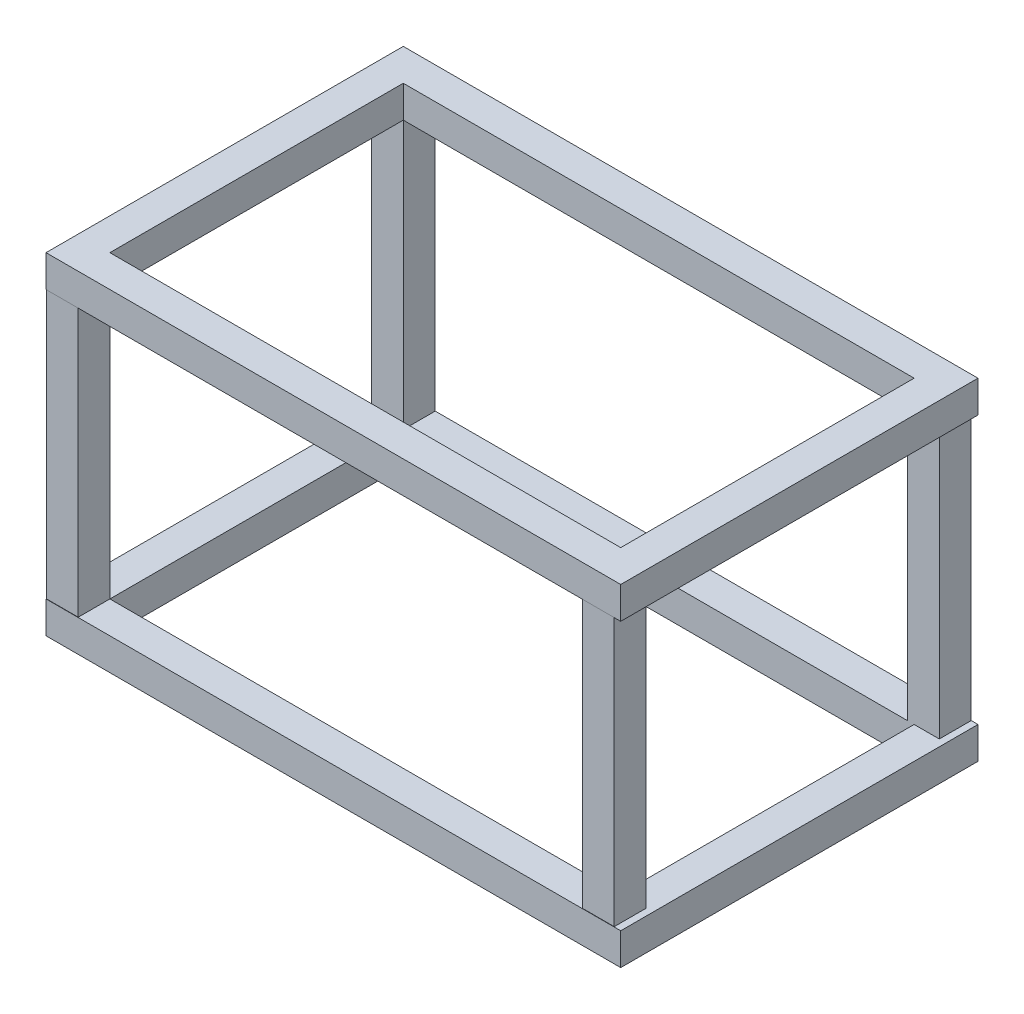
ISO-10303-21;
HEADER;
FILE_DESCRIPTION(('STEP AP214'),'2;1');
FILE_NAME('part.step','',(''),(''),'','','');
FILE_SCHEMA(('AUTOMOTIVE_DESIGN { 1 0 10303 214 1 1 1 1 }'));
ENDSEC;
DATA;
#1=APPLICATION_CONTEXT('core data for automotive mechanical design processes');
#2=APPLICATION_PROTOCOL_DEFINITION('international standard','automotive_design',2000,#1);
#3=PRODUCT_CONTEXT('',#1,'mechanical');
#4=PRODUCT('Part','Part','',(#3));
#5=PRODUCT_RELATED_PRODUCT_CATEGORY('part','',(#4));
#6=PRODUCT_DEFINITION_FORMATION('','',#4);
#7=PRODUCT_DEFINITION_CONTEXT('part definition',#1,'design');
#8=PRODUCT_DEFINITION('design','',#6,#7);
#9=PRODUCT_DEFINITION_SHAPE('','',#8);
#10=(LENGTH_UNIT() NAMED_UNIT(*) SI_UNIT(.MILLI.,.METRE.));
#11=(NAMED_UNIT(*) PLANE_ANGLE_UNIT() SI_UNIT($,.RADIAN.));
#12=(NAMED_UNIT(*) SI_UNIT($,.STERADIAN.) SOLID_ANGLE_UNIT());
#13=UNCERTAINTY_MEASURE_WITH_UNIT(LENGTH_MEASURE(1.E-05),#10,'distance_accuracy_value','');
#14=(GEOMETRIC_REPRESENTATION_CONTEXT(3) GLOBAL_UNCERTAINTY_ASSIGNED_CONTEXT((#13)) GLOBAL_UNIT_ASSIGNED_CONTEXT((#10,
#11,#12)) REPRESENTATION_CONTEXT('',''));
#15=CARTESIAN_POINT('',(0.,0.,0.));
#16=DIRECTION('',(0.,0.,1.));
#17=DIRECTION('',(1.,0.,0.));
#18=AXIS2_PLACEMENT_3D('',#15,#16,#17);
#19=CARTESIAN_POINT('',(0.,25.4,0.));
#20=DIRECTION('',(0.,1.,0.));
#21=DIRECTION('',(0.,0.,1.));
#22=AXIS2_PLACEMENT_3D('',#19,#20,#21);
#23=PLANE('',#22);
#24=DIRECTION('',(1.,0.,0.));
#25=VECTOR('',#24,1.);
#26=CARTESIAN_POINT('',(197.8,25.4,141.859));
#27=LINE('',#26,#25);
#28=CARTESIAN_POINT('',(197.8,25.4,141.859));
#29=VERTEX_POINT('',#28);
#30=CARTESIAN_POINT('',(223.2,25.4,141.859));
#31=VERTEX_POINT('',#30);
#32=EDGE_CURVE('E59',#29,#31,#27,.T.);
#33=ORIENTED_EDGE('',*,*,#32,.F.);
#34=DIRECTION('',(0.,0.,1.));
#35=VECTOR('',#34,1.);
#36=CARTESIAN_POINT('',(197.8,25.4,116.459));
#37=LINE('',#36,#35);
#38=CARTESIAN_POINT('',(197.8,25.4,116.713));
#39=VERTEX_POINT('',#38);
#40=EDGE_CURVE('E298',#39,#29,#37,.T.);
#41=ORIENTED_EDGE('',*,*,#40,.F.);
#42=DIRECTION('',(-1.,0.,0.));
#43=VECTOR('',#42,1.);
#44=CARTESIAN_POINT('',(0.,25.4,116.713));
#45=LINE('',#44,#43);
#46=CARTESIAN_POINT('',(-203.2,25.4,116.713));
#47=VERTEX_POINT('',#46);
#48=EDGE_CURVE('E519',#39,#47,#45,.T.);
#49=ORIENTED_EDGE('',*,*,#48,.T.);
#50=DIRECTION('',(0.,0.,-1.));
#51=VECTOR('',#50,1.);
#52=CARTESIAN_POINT('',(-203.2,25.4,116.459));
#53=LINE('',#52,#51);
#54=CARTESIAN_POINT('',(-203.2,25.4,141.859));
#55=VERTEX_POINT('',#54);
#56=EDGE_CURVE('E348',#55,#47,#53,.T.);
#57=ORIENTED_EDGE('',*,*,#56,.F.);
#58=DIRECTION('',(1.,0.,0.));
#59=VECTOR('',#58,1.);
#60=CARTESIAN_POINT('',(-228.6,25.4,141.859));
#61=LINE('',#60,#59);
#62=CARTESIAN_POINT('',(-228.6,25.4,141.859));
#63=VERTEX_POINT('',#62);
#64=EDGE_CURVE('E353',#63,#55,#61,.T.);
#65=ORIENTED_EDGE('',*,*,#64,.F.);
#66=DIRECTION('',(0.,0.,1.));
#67=VECTOR('',#66,1.);
#68=CARTESIAN_POINT('',(-228.6,25.4,0.));
#69=LINE('',#68,#67);
#70=CARTESIAN_POINT('',(-228.6,25.4,142.113));
#71=VERTEX_POINT('',#70);
#72=EDGE_CURVE('E494',#63,#71,#69,.T.);
#73=ORIENTED_EDGE('',*,*,#72,.T.);
#74=DIRECTION('',(-1.,0.,0.));
#75=VECTOR('',#74,1.);
#76=CARTESIAN_POINT('',(0.,25.4,142.113));
#77=LINE('',#76,#75);
#78=CARTESIAN_POINT('',(228.6,25.4,142.113));
#79=VERTEX_POINT('',#78);
#80=EDGE_CURVE('E500',#79,#71,#77,.T.);
#81=ORIENTED_EDGE('',*,*,#80,.F.);
#82=DIRECTION('',(0.,0.,1.));
#83=VECTOR('',#82,1.);
#84=CARTESIAN_POINT('',(228.6,25.4,0.));
#85=LINE('',#84,#83);
#86=CARTESIAN_POINT('',(228.6,25.4,-142.113));
#87=VERTEX_POINT('',#86);
#88=EDGE_CURVE('E504',#87,#79,#85,.T.);
#89=ORIENTED_EDGE('',*,*,#88,.F.);
#90=DIRECTION('',(-1.,0.,0.));
#91=VECTOR('',#90,1.);
#92=CARTESIAN_POINT('',(0.,25.4,-142.113));
#93=LINE('',#92,#91);
#94=CARTESIAN_POINT('',(223.2,25.4,-142.113));
#95=VERTEX_POINT('',#94);
#96=EDGE_CURVE('E491',#87,#95,#93,.T.);
#97=ORIENTED_EDGE('',*,*,#96,.T.);
#98=DIRECTION('',(0.,0.,-1.));
#99=VECTOR('',#98,1.);
#100=CARTESIAN_POINT('',(223.2,25.4,-142.113));
#101=LINE('',#100,#99);
#102=CARTESIAN_POINT('',(223.2,25.4,-116.713));
#103=VERTEX_POINT('',#102);
#104=EDGE_CURVE('E304',#103,#95,#101,.T.);
#105=ORIENTED_EDGE('',*,*,#104,.F.);
#106=DIRECTION('',(1.,0.,0.));
#107=VECTOR('',#106,1.);
#108=CARTESIAN_POINT('',(197.8,25.4,-116.713));
#109=LINE('',#108,#107);
#110=CARTESIAN_POINT('',(203.2,25.4,-116.713));
#111=VERTEX_POINT('',#110);
#112=EDGE_CURVE('E310',#111,#103,#109,.T.);
#113=ORIENTED_EDGE('',*,*,#112,.F.);
#114=DIRECTION('',(0.,0.,1.));
#115=VECTOR('',#114,1.);
#116=CARTESIAN_POINT('',(203.2,25.4,0.));
#117=LINE('',#116,#115);
#118=CARTESIAN_POINT('',(203.2,25.4,116.459));
#119=VERTEX_POINT('',#118);
#120=EDGE_CURVE('E515',#111,#119,#117,.T.);
#121=ORIENTED_EDGE('',*,*,#120,.T.);
#122=DIRECTION('',(-1.,0.,0.));
#123=VECTOR('',#122,1.);
#124=CARTESIAN_POINT('',(197.8,25.4,116.459));
#125=LINE('',#124,#123);
#126=CARTESIAN_POINT('',(223.2,25.4,116.459));
#127=VERTEX_POINT('',#126);
#128=EDGE_CURVE('E668',#127,#119,#125,.T.);
#129=ORIENTED_EDGE('',*,*,#128,.F.);
#130=DIRECTION('',(0.,0.,-1.));
#131=VECTOR('',#130,1.);
#132=CARTESIAN_POINT('',(223.2,25.4,116.459));
#133=LINE('',#132,#131);
#134=EDGE_CURVE('E64',#31,#127,#133,.T.);
#135=ORIENTED_EDGE('',*,*,#134,.F.);
#136=EDGE_LOOP('',(#33,#41,#49,#57,#65,#73,#81,#89,#97,#105,#113,#121,#129,#135));
#137=FACE_BOUND('',#136,.T.);
#138=ADVANCED_FACE('F41',(#137),#23,.T.);
#139=CARTESIAN_POINT('',(0.,238.572,0.));
#140=DIRECTION('',(0.,1.,0.));
#141=DIRECTION('',(0.,0.,1.));
#142=AXIS2_PLACEMENT_3D('',#139,#140,#141);
#143=PLANE('',#142);
#144=DIRECTION('',(0.,0.,1.));
#145=VECTOR('',#144,1.);
#146=CARTESIAN_POINT('',(197.8,238.572,116.459));
#147=LINE('',#146,#145);
#148=CARTESIAN_POINT('',(197.8,238.572,116.713));
#149=VERTEX_POINT('',#148);
#150=CARTESIAN_POINT('',(197.8,238.572,141.859));
#151=VERTEX_POINT('',#150);
#152=EDGE_CURVE('E266',#149,#151,#147,.T.);
#153=ORIENTED_EDGE('',*,*,#152,.T.);
#154=DIRECTION('',(1.,0.,0.));
#155=VECTOR('',#154,1.);
#156=CARTESIAN_POINT('',(197.8,238.572,141.859));
#157=LINE('',#156,#155);
#158=CARTESIAN_POINT('',(223.2,238.572,141.859));
#159=VERTEX_POINT('',#158);
#160=EDGE_CURVE('E271',#151,#159,#157,.T.);
#161=ORIENTED_EDGE('',*,*,#160,.T.);
#162=DIRECTION('',(0.,0.,-1.));
#163=VECTOR('',#162,1.);
#164=CARTESIAN_POINT('',(223.2,238.572,116.459));
#165=LINE('',#164,#163);
#166=CARTESIAN_POINT('',(223.2,238.572,116.459));
#167=VERTEX_POINT('',#166);
#168=EDGE_CURVE('E249',#159,#167,#165,.T.);
#169=ORIENTED_EDGE('',*,*,#168,.T.);
#170=DIRECTION('',(-1.,0.,0.));
#171=VECTOR('',#170,1.);
#172=CARTESIAN_POINT('',(197.8,238.572,116.459));
#173=LINE('',#172,#171);
#174=CARTESIAN_POINT('',(203.2,238.572,116.459));
#175=VERTEX_POINT('',#174);
#176=EDGE_CURVE('E258',#167,#175,#173,.T.);
#177=ORIENTED_EDGE('',*,*,#176,.T.);
#178=DIRECTION('',(0.,0.,1.));
#179=VECTOR('',#178,1.);
#180=CARTESIAN_POINT('',(203.2,238.572,0.));
#181=LINE('',#180,#179);
#182=CARTESIAN_POINT('',(203.2,238.572,-116.713));
#183=VERTEX_POINT('',#182);
#184=EDGE_CURVE('E431',#183,#175,#181,.T.);
#185=ORIENTED_EDGE('',*,*,#184,.F.);
#186=DIRECTION('',(1.,0.,0.));
#187=VECTOR('',#186,1.);
#188=CARTESIAN_POINT('',(197.8,238.572,-116.713));
#189=LINE('',#188,#187);
#190=CARTESIAN_POINT('',(223.2,238.572,-116.713));
#191=VERTEX_POINT('',#190);
#192=EDGE_CURVE('E323',#183,#191,#189,.T.);
#193=ORIENTED_EDGE('',*,*,#192,.T.);
#194=DIRECTION('',(0.,0.,-1.));
#195=VECTOR('',#194,1.);
#196=CARTESIAN_POINT('',(223.2,238.572,-142.113));
#197=LINE('',#196,#195);
#198=CARTESIAN_POINT('',(223.2,238.572,-142.113));
#199=VERTEX_POINT('',#198);
#200=EDGE_CURVE('E319',#191,#199,#197,.T.);
#201=ORIENTED_EDGE('',*,*,#200,.T.);
#202=DIRECTION('',(-1.,0.,0.));
#203=VECTOR('',#202,1.);
#204=CARTESIAN_POINT('',(0.,238.572,-142.113));
#205=LINE('',#204,#203);
#206=CARTESIAN_POINT('',(228.6,238.572,-142.113));
#207=VERTEX_POINT('',#206);
#208=EDGE_CURVE('E408',#207,#199,#205,.T.);
#209=ORIENTED_EDGE('',*,*,#208,.F.);
#210=DIRECTION('',(0.,0.,1.));
#211=VECTOR('',#210,1.);
#212=CARTESIAN_POINT('',(228.6,238.572,0.));
#213=LINE('',#212,#211);
#214=CARTESIAN_POINT('',(228.6,238.572,142.113));
#215=VERTEX_POINT('',#214);
#216=EDGE_CURVE('E421',#207,#215,#213,.T.);
#217=ORIENTED_EDGE('',*,*,#216,.T.);
#218=DIRECTION('',(-1.,0.,0.));
#219=VECTOR('',#218,1.);
#220=CARTESIAN_POINT('',(0.,238.572,142.113));
#221=LINE('',#220,#219);
#222=CARTESIAN_POINT('',(-228.6,238.572,142.113));
#223=VERTEX_POINT('',#222);
#224=EDGE_CURVE('E417',#215,#223,#221,.T.);
#225=ORIENTED_EDGE('',*,*,#224,.T.);
#226=DIRECTION('',(0.,0.,1.));
#227=VECTOR('',#226,1.);
#228=CARTESIAN_POINT('',(-228.6,238.572,0.));
#229=LINE('',#228,#227);
#230=CARTESIAN_POINT('',(-228.6,238.572,141.859));
#231=VERTEX_POINT('',#230);
#232=EDGE_CURVE('E412',#231,#223,#229,.T.);
#233=ORIENTED_EDGE('',*,*,#232,.F.);
#234=DIRECTION('',(1.,0.,0.));
#235=VECTOR('',#234,1.);
#236=CARTESIAN_POINT('',(-228.6,238.572,141.859));
#237=LINE('',#236,#235);
#238=CARTESIAN_POINT('',(-203.2,238.572,141.859));
#239=VERTEX_POINT('',#238);
#240=EDGE_CURVE('E363',#231,#239,#237,.T.);
#241=ORIENTED_EDGE('',*,*,#240,.T.);
#242=DIRECTION('',(0.,0.,-1.));
#243=VECTOR('',#242,1.);
#244=CARTESIAN_POINT('',(-203.2,238.572,116.459));
#245=LINE('',#244,#243);
#246=CARTESIAN_POINT('',(-203.2,238.572,116.713));
#247=VERTEX_POINT('',#246);
#248=EDGE_CURVE('E358',#239,#247,#245,.T.);
#249=ORIENTED_EDGE('',*,*,#248,.T.);
#250=DIRECTION('',(-1.,0.,0.));
#251=VECTOR('',#250,1.);
#252=CARTESIAN_POINT('',(0.,238.572,116.713));
#253=LINE('',#252,#251);
#254=EDGE_CURVE('E434',#149,#247,#253,.T.);
#255=ORIENTED_EDGE('',*,*,#254,.F.);
#256=EDGE_LOOP('',(#153,#161,#169,#177,#185,#193,#201,#209,#217,#225,#233,#241,#249,#255));
#257=FACE_BOUND('',#256,.T.);
#258=ADVANCED_FACE('F270',(#257),#143,.F.);
#259=DIRECTION('',(-1.,0.,0.));
#260=VECTOR('',#259,1.);
#261=CARTESIAN_POINT('',(0.,25.4,-116.713));
#262=LINE('',#261,#260);
#263=CARTESIAN_POINT('',(197.8,25.4,-116.713));
#264=VERTEX_POINT('',#263);
#265=CARTESIAN_POINT('',(-203.2,25.4,-116.713));
#266=VERTEX_POINT('',#265);
#267=EDGE_CURVE('E512',#264,#266,#262,.T.);
#268=ORIENTED_EDGE('',*,*,#267,.F.);
#269=DIRECTION('',(0.,0.,1.));
#270=VECTOR('',#269,1.);
#271=CARTESIAN_POINT('',(197.8,25.4,-142.113));
#272=LINE('',#271,#270);
#273=CARTESIAN_POINT('',(197.8,25.4,-142.113));
#274=VERTEX_POINT('',#273);
#275=EDGE_CURVE('E315',#274,#264,#272,.T.);
#276=ORIENTED_EDGE('',*,*,#275,.F.);
#277=CARTESIAN_POINT('',(-203.2,25.4,-142.113));
#278=VERTEX_POINT('',#277);
#279=EDGE_CURVE('E495',#274,#278,#93,.T.);
#280=ORIENTED_EDGE('',*,*,#279,.T.);
#281=DIRECTION('',(0.,0.,-1.));
#282=VECTOR('',#281,1.);
#283=CARTESIAN_POINT('',(-203.2,25.4,-142.113));
#284=LINE('',#283,#282);
#285=EDGE_CURVE('E463',#266,#278,#284,.T.);
#286=ORIENTED_EDGE('',*,*,#285,.F.);
#287=EDGE_LOOP('',(#268,#276,#280,#286));
#288=FACE_BOUND('',#287,.T.);
#289=ADVANCED_FACE('F606',(#288),#23,.T.);
#290=DIRECTION('',(0.,0.,1.));
#291=VECTOR('',#290,1.);
#292=CARTESIAN_POINT('',(197.8,238.572,-142.113));
#293=LINE('',#292,#291);
#294=CARTESIAN_POINT('',(197.8,238.572,-142.113));
#295=VERTEX_POINT('',#294);
#296=CARTESIAN_POINT('',(197.8,238.572,-116.713));
#297=VERTEX_POINT('',#296);
#298=EDGE_CURVE('E326',#295,#297,#293,.T.);
#299=ORIENTED_EDGE('',*,*,#298,.T.);
#300=DIRECTION('',(-1.,0.,0.));
#301=VECTOR('',#300,1.);
#302=CARTESIAN_POINT('',(0.,238.572,-116.713));
#303=LINE('',#302,#301);
#304=CARTESIAN_POINT('',(-203.2,238.572,-116.713));
#305=VERTEX_POINT('',#304);
#306=EDGE_CURVE('E428',#297,#305,#303,.T.);
#307=ORIENTED_EDGE('',*,*,#306,.T.);
#308=DIRECTION('',(0.,0.,-1.));
#309=VECTOR('',#308,1.);
#310=CARTESIAN_POINT('',(-203.2,238.572,-142.113));
#311=LINE('',#310,#309);
#312=CARTESIAN_POINT('',(-203.2,238.572,-142.113));
#313=VERTEX_POINT('',#312);
#314=EDGE_CURVE('E473',#305,#313,#311,.T.);
#315=ORIENTED_EDGE('',*,*,#314,.T.);
#316=EDGE_CURVE('E362',#295,#313,#205,.T.);
#317=ORIENTED_EDGE('',*,*,#316,.F.);
#318=EDGE_LOOP('',(#299,#307,#315,#317));
#319=FACE_BOUND('',#318,.T.);
#320=ADVANCED_FACE('F612',(#319),#143,.F.);
#321=CARTESIAN_POINT('',(-228.6,25.4,-116.713));
#322=VERTEX_POINT('',#321);
#323=CARTESIAN_POINT('',(-228.6,25.4,116.459));
#324=VERTEX_POINT('',#323);
#325=EDGE_CURVE('E496',#322,#324,#69,.T.);
#326=ORIENTED_EDGE('',*,*,#325,.T.);
#327=DIRECTION('',(-1.,0.,0.));
#328=VECTOR('',#327,1.);
#329=CARTESIAN_POINT('',(-228.6,25.4,116.459));
#330=LINE('',#329,#328);
#331=CARTESIAN_POINT('',(-203.2,25.4,116.459));
#332=VERTEX_POINT('',#331);
#333=EDGE_CURVE('E342',#332,#324,#330,.T.);
#334=ORIENTED_EDGE('',*,*,#333,.F.);
#335=DIRECTION('',(0.,0.,1.));
#336=VECTOR('',#335,1.);
#337=CARTESIAN_POINT('',(-203.2,25.4,0.));
#338=LINE('',#337,#336);
#339=EDGE_CURVE('E508',#266,#332,#338,.T.);
#340=ORIENTED_EDGE('',*,*,#339,.F.);
#341=DIRECTION('',(1.,0.,0.));
#342=VECTOR('',#341,1.);
#343=CARTESIAN_POINT('',(-228.6,25.4,-116.713));
#344=LINE('',#343,#342);
#345=EDGE_CURVE('E469',#322,#266,#344,.T.);
#346=ORIENTED_EDGE('',*,*,#345,.F.);
#347=EDGE_LOOP('',(#326,#334,#340,#346));
#348=FACE_BOUND('',#347,.T.);
#349=ADVANCED_FACE('F605',(#348),#23,.T.);
#350=DIRECTION('',(-1.,0.,0.));
#351=VECTOR('',#350,1.);
#352=CARTESIAN_POINT('',(-228.6,238.572,116.459));
#353=LINE('',#352,#351);
#354=CARTESIAN_POINT('',(-203.2,238.572,116.459));
#355=VERTEX_POINT('',#354);
#356=CARTESIAN_POINT('',(-228.6,238.572,116.459));
#357=VERTEX_POINT('',#356);
#358=EDGE_CURVE('E346',#355,#357,#353,.T.);
#359=ORIENTED_EDGE('',*,*,#358,.T.);
#360=CARTESIAN_POINT('',(-228.6,238.572,-116.713));
#361=VERTEX_POINT('',#360);
#362=EDGE_CURVE('E413',#361,#357,#229,.T.);
#363=ORIENTED_EDGE('',*,*,#362,.F.);
#364=DIRECTION('',(1.,0.,0.));
#365=VECTOR('',#364,1.);
#366=CARTESIAN_POINT('',(-228.6,238.572,-116.713));
#367=LINE('',#366,#365);
#368=EDGE_CURVE('E478',#361,#305,#367,.T.);
#369=ORIENTED_EDGE('',*,*,#368,.T.);
#370=DIRECTION('',(0.,0.,1.));
#371=VECTOR('',#370,1.);
#372=CARTESIAN_POINT('',(-203.2,238.572,0.));
#373=LINE('',#372,#371);
#374=EDGE_CURVE('E425',#305,#355,#373,.T.);
#375=ORIENTED_EDGE('',*,*,#374,.T.);
#376=EDGE_LOOP('',(#359,#363,#369,#375));
#377=FACE_BOUND('',#376,.T.);
#378=ADVANCED_FACE('F611',(#377),#143,.F.);
#379=CARTESIAN_POINT('',(-203.2,25.4,0.));
#380=DIRECTION('',(1.,0.,0.));
#381=DIRECTION('',(0.,0.,-1.));
#382=AXIS2_PLACEMENT_3D('',#379,#380,#381);
#383=PLANE('',#382);
#384=DIRECTION('',(0.,0.,1.));
#385=VECTOR('',#384,1.);
#386=CARTESIAN_POINT('',(-203.2,0.,0.));
#387=LINE('',#386,#385);
#388=CARTESIAN_POINT('',(-203.2,0.,-116.713));
#389=VERTEX_POINT('',#388);
#390=CARTESIAN_POINT('',(-203.2,0.,116.713));
#391=VERTEX_POINT('',#390);
#392=EDGE_CURVE('E540',#389,#391,#387,.T.);
#393=ORIENTED_EDGE('',*,*,#392,.F.);
#394=DIRECTION('',(0.,-1.,0.));
#395=VECTOR('',#394,1.);
#396=CARTESIAN_POINT('',(-203.2,25.4,-116.713));
#397=LINE('',#396,#395);
#398=EDGE_CURVE('E11',#266,#389,#397,.T.);
#399=ORIENTED_EDGE('',*,*,#398,.F.);
#400=ORIENTED_EDGE('',*,*,#339,.T.);
#401=DIRECTION('',(0.,-1.,0.));
#402=VECTOR('',#401,1.);
#403=CARTESIAN_POINT('',(-203.2,274.493024484277,116.459));
#404=LINE('',#403,#402);
#405=EDGE_CURVE('E347',#355,#332,#404,.T.);
#406=ORIENTED_EDGE('',*,*,#405,.F.);
#407=ORIENTED_EDGE('',*,*,#374,.F.);
#408=DIRECTION('',(0.,-1.,0.));
#409=VECTOR('',#408,1.);
#410=CARTESIAN_POINT('',(-203.2,263.972,-116.713));
#411=LINE('',#410,#409);
#412=CARTESIAN_POINT('',(-203.2,263.972,-116.713));
#413=VERTEX_POINT('',#412);
#414=EDGE_CURVE('E450',#413,#305,#411,.T.);
#415=ORIENTED_EDGE('',*,*,#414,.F.);
#416=DIRECTION('',(0.,0.,1.));
#417=VECTOR('',#416,1.);
#418=CARTESIAN_POINT('',(-203.2,263.972,0.));
#419=LINE('',#418,#417);
#420=CARTESIAN_POINT('',(-203.2,263.972,116.713));
#421=VERTEX_POINT('',#420);
#422=EDGE_CURVE('E392',#413,#421,#419,.T.);
#423=ORIENTED_EDGE('',*,*,#422,.T.);
#424=DIRECTION('',(0.,-1.,0.));
#425=VECTOR('',#424,1.);
#426=CARTESIAN_POINT('',(-203.2,263.972,116.713));
#427=LINE('',#426,#425);
#428=EDGE_CURVE('E438',#421,#247,#427,.T.);
#429=ORIENTED_EDGE('',*,*,#428,.T.);
#430=ORIENTED_EDGE('',*,*,#248,.F.);
#431=DIRECTION('',(0.,-1.,0.));
#432=VECTOR('',#431,1.);
#433=CARTESIAN_POINT('',(-203.2,274.493024484277,141.859));
#434=LINE('',#433,#432);
#435=EDGE_CURVE('E352',#239,#55,#434,.T.);
#436=ORIENTED_EDGE('',*,*,#435,.T.);
#437=ORIENTED_EDGE('',*,*,#56,.T.);
#438=DIRECTION('',(0.,-1.,0.));
#439=VECTOR('',#438,1.);
#440=CARTESIAN_POINT('',(-203.2,25.4,116.713));
#441=LINE('',#440,#439);
#442=EDGE_CURVE('E556',#47,#391,#441,.T.);
#443=ORIENTED_EDGE('',*,*,#442,.T.);
#444=EDGE_LOOP('',(#393,#399,#400,#406,#407,#415,#423,#429,#430,#436,#437,#443));
#445=FACE_BOUND('',#444,.T.);
#446=ADVANCED_FACE('F703',(#445),#383,.T.);
#447=CARTESIAN_POINT('',(0.,25.4,-116.713));
#448=DIRECTION('',(0.,0.,1.));
#449=DIRECTION('',(1.,0.,0.));
#450=AXIS2_PLACEMENT_3D('',#447,#448,#449);
#451=PLANE('',#450);
#452=DIRECTION('',(-1.,0.,0.));
#453=VECTOR('',#452,1.);
#454=CARTESIAN_POINT('',(0.,0.,-116.713));
#455=LINE('',#454,#453);
#456=CARTESIAN_POINT('',(203.2,0.,-116.713));
#457=VERTEX_POINT('',#456);
#458=EDGE_CURVE('E544',#457,#389,#455,.T.);
#459=ORIENTED_EDGE('',*,*,#458,.F.);
#460=DIRECTION('',(0.,-1.,0.));
#461=VECTOR('',#460,1.);
#462=CARTESIAN_POINT('',(203.2,25.4,-116.713));
#463=LINE('',#462,#461);
#464=EDGE_CURVE('E51',#111,#457,#463,.T.);
#465=ORIENTED_EDGE('',*,*,#464,.F.);
#466=ORIENTED_EDGE('',*,*,#112,.T.);
#467=DIRECTION('',(0.,-1.,0.));
#468=VECTOR('',#467,1.);
#469=CARTESIAN_POINT('',(223.2,274.493024484277,-116.713));
#470=LINE('',#469,#468);
#471=EDGE_CURVE('E309',#191,#103,#470,.T.);
#472=ORIENTED_EDGE('',*,*,#471,.F.);
#473=ORIENTED_EDGE('',*,*,#192,.F.);
#474=DIRECTION('',(0.,-1.,0.));
#475=VECTOR('',#474,1.);
#476=CARTESIAN_POINT('',(203.2,263.972,-116.713));
#477=LINE('',#476,#475);
#478=CARTESIAN_POINT('',(203.2,263.972,-116.713));
#479=VERTEX_POINT('',#478);
#480=EDGE_CURVE('E447',#479,#183,#477,.T.);
#481=ORIENTED_EDGE('',*,*,#480,.F.);
#482=DIRECTION('',(-1.,0.,0.));
#483=VECTOR('',#482,1.);
#484=CARTESIAN_POINT('',(0.,263.972,-116.713));
#485=LINE('',#484,#483);
#486=EDGE_CURVE('E396',#479,#413,#485,.T.);
#487=ORIENTED_EDGE('',*,*,#486,.T.);
#488=ORIENTED_EDGE('',*,*,#414,.T.);
#489=ORIENTED_EDGE('',*,*,#306,.F.);
#490=DIRECTION('',(0.,-1.,0.));
#491=VECTOR('',#490,1.);
#492=CARTESIAN_POINT('',(197.8,274.493024484277,-116.713));
#493=LINE('',#492,#491);
#494=EDGE_CURVE('E314',#297,#264,#493,.T.);
#495=ORIENTED_EDGE('',*,*,#494,.T.);
#496=ORIENTED_EDGE('',*,*,#267,.T.);
#497=ORIENTED_EDGE('',*,*,#398,.T.);
#498=EDGE_LOOP('',(#459,#465,#466,#472,#473,#481,#487,#488,#489,#495,#496,#497));
#499=FACE_BOUND('',#498,.T.);
#500=ADVANCED_FACE('F629',(#499),#451,.T.);
#501=CARTESIAN_POINT('',(203.2,25.4,0.));
#502=DIRECTION('',(1.,0.,0.));
#503=DIRECTION('',(0.,0.,-1.));
#504=AXIS2_PLACEMENT_3D('',#501,#502,#503);
#505=PLANE('',#504);
#506=DIRECTION('',(0.,0.,1.));
#507=VECTOR('',#506,1.);
#508=CARTESIAN_POINT('',(203.2,0.,0.));
#509=LINE('',#508,#507);
#510=CARTESIAN_POINT('',(203.2,0.,116.713));
#511=VERTEX_POINT('',#510);
#512=EDGE_CURVE('E548',#457,#511,#509,.T.);
#513=ORIENTED_EDGE('',*,*,#512,.T.);
#514=DIRECTION('',(0.,-1.,0.));
#515=VECTOR('',#514,1.);
#516=CARTESIAN_POINT('',(203.2,25.4,116.713));
#517=LINE('',#516,#515);
#518=CARTESIAN_POINT('',(203.2,25.4,116.713));
#519=VERTEX_POINT('',#518);
#520=EDGE_CURVE('E559',#519,#511,#517,.T.);
#521=ORIENTED_EDGE('',*,*,#520,.F.);
#522=DIRECTION('',(0.,0.,1.));
#523=VECTOR('',#522,1.);
#524=CARTESIAN_POINT('',(203.2,25.4,0.));
#525=LINE('',#524,#523);
#526=EDGE_CURVE('E278',#119,#519,#525,.T.);
#527=ORIENTED_EDGE('',*,*,#526,.F.);
#528=ORIENTED_EDGE('',*,*,#120,.F.);
#529=ORIENTED_EDGE('',*,*,#464,.T.);
#530=EDGE_LOOP('',(#513,#521,#527,#528,#529));
#531=FACE_BOUND('',#530,.T.);
#532=ADVANCED_FACE('F665',(#531),#505,.F.);
#533=CARTESIAN_POINT('',(0.,25.4,-142.113));
#534=DIRECTION('',(0.,0.,1.));
#535=DIRECTION('',(1.,0.,0.));
#536=AXIS2_PLACEMENT_3D('',#533,#534,#535);
#537=PLANE('',#536);
#538=ORIENTED_EDGE('',*,*,#279,.F.);
#539=DIRECTION('',(0.,-1.,0.));
#540=VECTOR('',#539,1.);
#541=CARTESIAN_POINT('',(197.8,274.493024484277,-142.113));
#542=LINE('',#541,#540);
#543=EDGE_CURVE('E303',#295,#274,#542,.T.);
#544=ORIENTED_EDGE('',*,*,#543,.F.);
#545=ORIENTED_EDGE('',*,*,#316,.T.);
#546=DIRECTION('',(0.,-1.,0.));
#547=VECTOR('',#546,1.);
#548=CARTESIAN_POINT('',(-203.2,274.493024484277,-142.113));
#549=LINE('',#548,#547);
#550=EDGE_CURVE('E467',#313,#278,#549,.T.);
#551=ORIENTED_EDGE('',*,*,#550,.T.);
#552=EDGE_LOOP('',(#538,#544,#545,#551));
#553=FACE_BOUND('',#552,.T.);
#554=DIRECTION('',(-1.,0.,0.));
#555=VECTOR('',#554,1.);
#556=CARTESIAN_POINT('',(0.,0.,-142.113));
#557=LINE('',#556,#555);
#558=CARTESIAN_POINT('',(228.6,0.,-142.113));
#559=VERTEX_POINT('',#558);
#560=CARTESIAN_POINT('',(-228.6,0.,-142.113));
#561=VERTEX_POINT('',#560);
#562=EDGE_CURVE('E477',#559,#561,#557,.T.);
#563=ORIENTED_EDGE('',*,*,#562,.T.);
#564=DIRECTION('',(0.,-1.,0.));
#565=VECTOR('',#564,1.);
#566=CARTESIAN_POINT('',(-228.6,25.4,-142.113));
#567=LINE('',#566,#565);
#568=CARTESIAN_POINT('',(-228.6,263.972,-142.113));
#569=VERTEX_POINT('',#568);
#570=EDGE_CURVE('E45',#569,#561,#567,.T.);
#571=ORIENTED_EDGE('',*,*,#570,.F.);
#572=DIRECTION('',(-1.,0.,0.));
#573=VECTOR('',#572,1.);
#574=CARTESIAN_POINT('',(0.,263.972,-142.113));
#575=LINE('',#574,#573);
#576=CARTESIAN_POINT('',(228.6,263.972,-142.113));
#577=VERTEX_POINT('',#576);
#578=EDGE_CURVE('E376',#577,#569,#575,.T.);
#579=ORIENTED_EDGE('',*,*,#578,.F.);
#580=DIRECTION('',(0.,-1.,0.));
#581=VECTOR('',#580,1.);
#582=CARTESIAN_POINT('',(228.6,263.972,-142.113));
#583=LINE('',#582,#581);
#584=EDGE_CURVE('E407',#577,#207,#583,.T.);
#585=ORIENTED_EDGE('',*,*,#584,.T.);
#586=ORIENTED_EDGE('',*,*,#208,.T.);
#587=DIRECTION('',(0.,-1.,0.));
#588=VECTOR('',#587,1.);
#589=CARTESIAN_POINT('',(223.2,274.493024484277,-142.113));
#590=LINE('',#589,#588);
#591=EDGE_CURVE('E308',#199,#95,#590,.T.);
#592=ORIENTED_EDGE('',*,*,#591,.T.);
#593=ORIENTED_EDGE('',*,*,#96,.F.);
#594=DIRECTION('',(0.,-1.,0.));
#595=VECTOR('',#594,1.);
#596=CARTESIAN_POINT('',(228.6,25.4,-142.113));
#597=LINE('',#596,#595);
#598=EDGE_CURVE('E524',#87,#559,#597,.T.);
#599=ORIENTED_EDGE('',*,*,#598,.T.);
#600=EDGE_LOOP('',(#563,#571,#579,#585,#586,#592,#593,#599));
#601=FACE_BOUND('',#600,.T.);
#602=ADVANCED_FACE('F43',(#553,#601),#537,.F.);
#603=CARTESIAN_POINT('',(-228.6,25.4,0.));
#604=DIRECTION('',(1.,0.,0.));
#605=DIRECTION('',(0.,0.,-1.));
#606=AXIS2_PLACEMENT_3D('',#603,#604,#605);
#607=PLANE('',#606);
#608=ORIENTED_EDGE('',*,*,#72,.F.);
#609=DIRECTION('',(0.,-1.,0.));
#610=VECTOR('',#609,1.);
#611=CARTESIAN_POINT('',(-228.6,274.493024484277,141.859));
#612=LINE('',#611,#610);
#613=EDGE_CURVE('E357',#231,#63,#612,.T.);
#614=ORIENTED_EDGE('',*,*,#613,.F.);
#615=ORIENTED_EDGE('',*,*,#232,.T.);
#616=DIRECTION('',(0.,-1.,0.));
#617=VECTOR('',#616,1.);
#618=CARTESIAN_POINT('',(-228.6,263.972,142.113));
#619=LINE('',#618,#617);
#620=CARTESIAN_POINT('',(-228.6,263.972,142.113));
#621=VERTEX_POINT('',#620);
#622=EDGE_CURVE('E443',#621,#223,#619,.T.);
#623=ORIENTED_EDGE('',*,*,#622,.F.);
#624=DIRECTION('',(0.,0.,1.));
#625=VECTOR('',#624,1.);
#626=CARTESIAN_POINT('',(-228.6,263.972,0.));
#627=LINE('',#626,#625);
#628=EDGE_CURVE('E380',#569,#621,#627,.T.);
#629=ORIENTED_EDGE('',*,*,#628,.F.);
#630=ORIENTED_EDGE('',*,*,#570,.T.);
#631=DIRECTION('',(0.,0.,1.));
#632=VECTOR('',#631,1.);
#633=CARTESIAN_POINT('',(-228.6,0.,0.));
#634=LINE('',#633,#632);
#635=CARTESIAN_POINT('',(-228.6,0.,142.113));
#636=VERTEX_POINT('',#635);
#637=EDGE_CURVE('E528',#561,#636,#634,.T.);
#638=ORIENTED_EDGE('',*,*,#637,.T.);
#639=DIRECTION('',(0.,-1.,0.));
#640=VECTOR('',#639,1.);
#641=CARTESIAN_POINT('',(-228.6,25.4,142.113));
#642=LINE('',#641,#640);
#643=EDGE_CURVE('E569',#71,#636,#642,.T.);
#644=ORIENTED_EDGE('',*,*,#643,.F.);
#645=EDGE_LOOP('',(#608,#614,#615,#623,#629,#630,#638,#644));
#646=FACE_BOUND('',#645,.T.);
#647=DIRECTION('',(0.,-1.,0.));
#648=VECTOR('',#647,1.);
#649=CARTESIAN_POINT('',(-228.6,274.493024484277,116.459));
#650=LINE('',#649,#648);
#651=EDGE_CURVE('E322',#357,#324,#650,.T.);
#652=ORIENTED_EDGE('',*,*,#651,.T.);
#653=ORIENTED_EDGE('',*,*,#325,.F.);
#654=DIRECTION('',(0.,-1.,0.));
#655=VECTOR('',#654,1.);
#656=CARTESIAN_POINT('',(-228.6,274.493024484277,-116.713));
#657=LINE('',#656,#655);
#658=EDGE_CURVE('E454',#361,#322,#657,.T.);
#659=ORIENTED_EDGE('',*,*,#658,.F.);
#660=ORIENTED_EDGE('',*,*,#362,.T.);
#661=EDGE_LOOP('',(#652,#653,#659,#660));
#662=FACE_BOUND('',#661,.T.);
#663=ADVANCED_FACE('F579',(#646,#662),#607,.F.);
#664=CARTESIAN_POINT('',(0.,25.4,142.113));
#665=DIRECTION('',(0.,0.,1.));
#666=DIRECTION('',(1.,0.,0.));
#667=AXIS2_PLACEMENT_3D('',#664,#665,#666);
#668=PLANE('',#667);
#669=DIRECTION('',(-1.,0.,0.));
#670=VECTOR('',#669,1.);
#671=CARTESIAN_POINT('',(0.,0.,142.113));
#672=LINE('',#671,#670);
#673=CARTESIAN_POINT('',(228.6,0.,142.113));
#674=VERTEX_POINT('',#673);
#675=EDGE_CURVE('E532',#674,#636,#672,.T.);
#676=ORIENTED_EDGE('',*,*,#675,.F.);
#677=DIRECTION('',(0.,-1.,0.));
#678=VECTOR('',#677,1.);
#679=CARTESIAN_POINT('',(228.6,25.4,142.113));
#680=LINE('',#679,#678);
#681=EDGE_CURVE('E567',#79,#674,#680,.T.);
#682=ORIENTED_EDGE('',*,*,#681,.F.);
#683=ORIENTED_EDGE('',*,*,#80,.T.);
#684=ORIENTED_EDGE('',*,*,#643,.T.);
#685=EDGE_LOOP('',(#676,#682,#683,#684));
#686=FACE_BOUND('',#685,.T.);
#687=ADVANCED_FACE('F594',(#686),#668,.T.);
#688=CARTESIAN_POINT('',(228.6,25.4,0.));
#689=DIRECTION('',(1.,0.,0.));
#690=DIRECTION('',(0.,0.,-1.));
#691=AXIS2_PLACEMENT_3D('',#688,#689,#690);
#692=PLANE('',#691);
#693=DIRECTION('',(0.,0.,1.));
#694=VECTOR('',#693,1.);
#695=CARTESIAN_POINT('',(228.6,0.,0.));
#696=LINE('',#695,#694);
#697=EDGE_CURVE('E536',#559,#674,#696,.T.);
#698=ORIENTED_EDGE('',*,*,#697,.F.);
#699=ORIENTED_EDGE('',*,*,#598,.F.);
#700=ORIENTED_EDGE('',*,*,#88,.T.);
#701=ORIENTED_EDGE('',*,*,#681,.T.);
#702=EDGE_LOOP('',(#698,#699,#700,#701));
#703=FACE_BOUND('',#702,.T.);
#704=ADVANCED_FACE('F591',(#703),#692,.T.);
#705=CARTESIAN_POINT('',(0.,25.4,116.713));
#706=DIRECTION('',(0.,0.,1.));
#707=DIRECTION('',(1.,0.,0.));
#708=AXIS2_PLACEMENT_3D('',#705,#706,#707);
#709=PLANE('',#708);
#710=DIRECTION('',(-1.,0.,0.));
#711=VECTOR('',#710,1.);
#712=CARTESIAN_POINT('',(0.,0.,116.713));
#713=LINE('',#712,#711);
#714=EDGE_CURVE('E552',#511,#391,#713,.T.);
#715=ORIENTED_EDGE('',*,*,#714,.T.);
#716=ORIENTED_EDGE('',*,*,#442,.F.);
#717=ORIENTED_EDGE('',*,*,#48,.F.);
#718=EDGE_CURVE('E520',#519,#39,#45,.T.);
#719=ORIENTED_EDGE('',*,*,#718,.F.);
#720=ORIENTED_EDGE('',*,*,#520,.T.);
#721=EDGE_LOOP('',(#715,#716,#717,#719,#720));
#722=FACE_BOUND('',#721,.T.);
#723=ADVANCED_FACE('F601',(#722),#709,.F.);
#724=CARTESIAN_POINT('',(0.,0.,0.));
#725=DIRECTION('',(0.,1.,0.));
#726=DIRECTION('',(0.,0.,1.));
#727=AXIS2_PLACEMENT_3D('',#724,#725,#726);
#728=PLANE('',#727);
#729=ORIENTED_EDGE('',*,*,#562,.F.);
#730=ORIENTED_EDGE('',*,*,#697,.T.);
#731=ORIENTED_EDGE('',*,*,#675,.T.);
#732=ORIENTED_EDGE('',*,*,#637,.F.);
#733=EDGE_LOOP('',(#729,#730,#731,#732));
#734=FACE_BOUND('',#733,.T.);
#735=ORIENTED_EDGE('',*,*,#392,.T.);
#736=ORIENTED_EDGE('',*,*,#714,.F.);
#737=ORIENTED_EDGE('',*,*,#512,.F.);
#738=ORIENTED_EDGE('',*,*,#458,.T.);
#739=EDGE_LOOP('',(#735,#736,#737,#738));
#740=FACE_BOUND('',#739,.T.);
#741=ADVANCED_FACE('F588',(#734,#740),#728,.F.);
#742=CARTESIAN_POINT('',(-228.6,274.493024484277,-116.713));
#743=DIRECTION('',(0.,0.,-1.));
#744=DIRECTION('',(-1.,0.,0.));
#745=AXIS2_PLACEMENT_3D('',#742,#743,#744);
#746=PLANE('',#745);
#747=ORIENTED_EDGE('',*,*,#368,.F.);
#748=ORIENTED_EDGE('',*,*,#658,.T.);
#749=ORIENTED_EDGE('',*,*,#345,.T.);
#750=DIRECTION('',(0.,-1.,0.));
#751=VECTOR('',#750,1.);
#752=CARTESIAN_POINT('',(-203.2,274.493024484277,-116.713));
#753=LINE('',#752,#751);
#754=EDGE_CURVE('E468',#305,#266,#753,.T.);
#755=ORIENTED_EDGE('',*,*,#754,.F.);
#756=EDGE_LOOP('',(#747,#748,#749,#755));
#757=FACE_BOUND('',#756,.T.);
#758=ADVANCED_FACE('F712',(#757),#746,.F.);
#759=CARTESIAN_POINT('',(-203.2,274.493024484277,-142.113));
#760=DIRECTION('',(-1.,0.,0.));
#761=DIRECTION('',(0.,0.,1.));
#762=AXIS2_PLACEMENT_3D('',#759,#760,#761);
#763=PLANE('',#762);
#764=ORIENTED_EDGE('',*,*,#314,.F.);
#765=ORIENTED_EDGE('',*,*,#754,.T.);
#766=ORIENTED_EDGE('',*,*,#285,.T.);
#767=ORIENTED_EDGE('',*,*,#550,.F.);
#768=EDGE_LOOP('',(#764,#765,#766,#767));
#769=FACE_BOUND('',#768,.T.);
#770=ADVANCED_FACE('F743',(#769),#763,.F.);
#771=CARTESIAN_POINT('',(203.2,263.972,0.));
#772=DIRECTION('',(1.,0.,0.));
#773=DIRECTION('',(0.,0.,-1.));
#774=AXIS2_PLACEMENT_3D('',#771,#772,#773);
#775=PLANE('',#774);
#776=ORIENTED_EDGE('',*,*,#184,.T.);
#777=DIRECTION('',(0.,0.,1.));
#778=VECTOR('',#777,1.);
#779=CARTESIAN_POINT('',(203.2,238.572,0.));
#780=LINE('',#779,#778);
#781=CARTESIAN_POINT('',(203.2,238.572,116.713));
#782=VERTEX_POINT('',#781);
#783=EDGE_CURVE('E273',#175,#782,#780,.T.);
#784=ORIENTED_EDGE('',*,*,#783,.T.);
#785=DIRECTION('',(0.,-1.,0.));
#786=VECTOR('',#785,1.);
#787=CARTESIAN_POINT('',(203.2,263.972,116.713));
#788=LINE('',#787,#786);
#789=CARTESIAN_POINT('',(203.2,263.972,116.713));
#790=VERTEX_POINT('',#789);
#791=EDGE_CURVE('E442',#790,#782,#788,.T.);
#792=ORIENTED_EDGE('',*,*,#791,.F.);
#793=DIRECTION('',(0.,0.,1.));
#794=VECTOR('',#793,1.);
#795=CARTESIAN_POINT('',(203.2,263.972,0.));
#796=LINE('',#795,#794);
#797=EDGE_CURVE('E400',#479,#790,#796,.T.);
#798=ORIENTED_EDGE('',*,*,#797,.F.);
#799=ORIENTED_EDGE('',*,*,#480,.T.);
#800=EDGE_LOOP('',(#776,#784,#792,#798,#799));
#801=FACE_BOUND('',#800,.T.);
#802=ADVANCED_FACE('F697',(#801),#775,.F.);
#803=CARTESIAN_POINT('',(0.,263.972,142.113));
#804=DIRECTION('',(0.,0.,1.));
#805=DIRECTION('',(1.,0.,0.));
#806=AXIS2_PLACEMENT_3D('',#803,#804,#805);
#807=PLANE('',#806);
#808=ORIENTED_EDGE('',*,*,#224,.F.);
#809=DIRECTION('',(0.,-1.,0.));
#810=VECTOR('',#809,1.);
#811=CARTESIAN_POINT('',(228.6,263.972,142.113));
#812=LINE('',#811,#810);
#813=CARTESIAN_POINT('',(228.6,263.972,142.113));
#814=VERTEX_POINT('',#813);
#815=EDGE_CURVE('E457',#814,#215,#812,.T.);
#816=ORIENTED_EDGE('',*,*,#815,.F.);
#817=DIRECTION('',(-1.,0.,0.));
#818=VECTOR('',#817,1.);
#819=CARTESIAN_POINT('',(0.,263.972,142.113));
#820=LINE('',#819,#818);
#821=EDGE_CURVE('E384',#814,#621,#820,.T.);
#822=ORIENTED_EDGE('',*,*,#821,.T.);
#823=ORIENTED_EDGE('',*,*,#622,.T.);
#824=EDGE_LOOP('',(#808,#816,#822,#823));
#825=FACE_BOUND('',#824,.T.);
#826=ADVANCED_FACE('F645',(#825),#807,.T.);
#827=CARTESIAN_POINT('',(228.6,263.972,0.));
#828=DIRECTION('',(1.,0.,0.));
#829=DIRECTION('',(0.,0.,-1.));
#830=AXIS2_PLACEMENT_3D('',#827,#828,#829);
#831=PLANE('',#830);
#832=ORIENTED_EDGE('',*,*,#216,.F.);
#833=ORIENTED_EDGE('',*,*,#584,.F.);
#834=DIRECTION('',(0.,0.,1.));
#835=VECTOR('',#834,1.);
#836=CARTESIAN_POINT('',(228.6,263.972,0.));
#837=LINE('',#836,#835);
#838=EDGE_CURVE('E388',#577,#814,#837,.T.);
#839=ORIENTED_EDGE('',*,*,#838,.T.);
#840=ORIENTED_EDGE('',*,*,#815,.T.);
#841=EDGE_LOOP('',(#832,#833,#839,#840));
#842=FACE_BOUND('',#841,.T.);
#843=ADVANCED_FACE('F650',(#842),#831,.T.);
#844=CARTESIAN_POINT('',(0.,263.972,116.713));
#845=DIRECTION('',(0.,0.,1.));
#846=DIRECTION('',(1.,0.,0.));
#847=AXIS2_PLACEMENT_3D('',#844,#845,#846);
#848=PLANE('',#847);
#849=EDGE_CURVE('E381',#782,#149,#253,.T.);
#850=ORIENTED_EDGE('',*,*,#849,.T.);
#851=ORIENTED_EDGE('',*,*,#254,.T.);
#852=ORIENTED_EDGE('',*,*,#428,.F.);
#853=DIRECTION('',(-1.,0.,0.));
#854=VECTOR('',#853,1.);
#855=CARTESIAN_POINT('',(0.,263.972,116.713));
#856=LINE('',#855,#854);
#857=EDGE_CURVE('E404',#790,#421,#856,.T.);
#858=ORIENTED_EDGE('',*,*,#857,.F.);
#859=ORIENTED_EDGE('',*,*,#791,.T.);
#860=EDGE_LOOP('',(#850,#851,#852,#858,#859));
#861=FACE_BOUND('',#860,.T.);
#862=ADVANCED_FACE('F692',(#861),#848,.F.);
#863=CARTESIAN_POINT('',(0.,263.972,0.));
#864=DIRECTION('',(0.,1.,0.));
#865=DIRECTION('',(0.,0.,1.));
#866=AXIS2_PLACEMENT_3D('',#863,#864,#865);
#867=PLANE('',#866);
#868=ORIENTED_EDGE('',*,*,#578,.T.);
#869=ORIENTED_EDGE('',*,*,#628,.T.);
#870=ORIENTED_EDGE('',*,*,#821,.F.);
#871=ORIENTED_EDGE('',*,*,#838,.F.);
#872=EDGE_LOOP('',(#868,#869,#870,#871));
#873=FACE_BOUND('',#872,.T.);
#874=ORIENTED_EDGE('',*,*,#422,.F.);
#875=ORIENTED_EDGE('',*,*,#486,.F.);
#876=ORIENTED_EDGE('',*,*,#797,.T.);
#877=ORIENTED_EDGE('',*,*,#857,.T.);
#878=EDGE_LOOP('',(#874,#875,#876,#877));
#879=FACE_BOUND('',#878,.T.);
#880=ADVANCED_FACE('F653',(#873,#879),#867,.T.);
#881=CARTESIAN_POINT('',(-228.6,274.493024484277,141.859));
#882=DIRECTION('',(0.,0.,-1.));
#883=DIRECTION('',(-1.,0.,0.));
#884=AXIS2_PLACEMENT_3D('',#881,#882,#883);
#885=PLANE('',#884);
#886=ORIENTED_EDGE('',*,*,#240,.F.);
#887=ORIENTED_EDGE('',*,*,#613,.T.);
#888=ORIENTED_EDGE('',*,*,#64,.T.);
#889=ORIENTED_EDGE('',*,*,#435,.F.);
#890=EDGE_LOOP('',(#886,#887,#888,#889));
#891=FACE_BOUND('',#890,.T.);
#892=ADVANCED_FACE('F726',(#891),#885,.F.);
#893=CARTESIAN_POINT('',(-228.6,274.493024484277,116.459));
#894=DIRECTION('',(0.,0.,1.));
#895=DIRECTION('',(1.,0.,0.));
#896=AXIS2_PLACEMENT_3D('',#893,#894,#895);
#897=PLANE('',#896);
#898=ORIENTED_EDGE('',*,*,#358,.F.);
#899=ORIENTED_EDGE('',*,*,#405,.T.);
#900=ORIENTED_EDGE('',*,*,#333,.T.);
#901=ORIENTED_EDGE('',*,*,#651,.F.);
#902=EDGE_LOOP('',(#898,#899,#900,#901));
#903=FACE_BOUND('',#902,.T.);
#904=ADVANCED_FACE('F728',(#903),#897,.F.);
#905=CARTESIAN_POINT('',(197.8,274.493024484277,-142.113));
#906=DIRECTION('',(1.,0.,0.));
#907=DIRECTION('',(0.,0.,-1.));
#908=AXIS2_PLACEMENT_3D('',#905,#906,#907);
#909=PLANE('',#908);
#910=ORIENTED_EDGE('',*,*,#298,.F.);
#911=ORIENTED_EDGE('',*,*,#543,.T.);
#912=ORIENTED_EDGE('',*,*,#275,.T.);
#913=ORIENTED_EDGE('',*,*,#494,.F.);
#914=EDGE_LOOP('',(#910,#911,#912,#913));
#915=FACE_BOUND('',#914,.T.);
#916=ADVANCED_FACE('F632',(#915),#909,.F.);
#917=CARTESIAN_POINT('',(223.2,274.493024484277,-142.113));
#918=DIRECTION('',(-1.,0.,0.));
#919=DIRECTION('',(0.,0.,1.));
#920=AXIS2_PLACEMENT_3D('',#917,#918,#919);
#921=PLANE('',#920);
#922=ORIENTED_EDGE('',*,*,#200,.F.);
#923=ORIENTED_EDGE('',*,*,#471,.T.);
#924=ORIENTED_EDGE('',*,*,#104,.T.);
#925=ORIENTED_EDGE('',*,*,#591,.F.);
#926=EDGE_LOOP('',(#922,#923,#924,#925));
#927=FACE_BOUND('',#926,.T.);
#928=ADVANCED_FACE('F658',(#927),#921,.F.);
#929=CARTESIAN_POINT('',(426.4,25.4,258.572));
#930=DIRECTION('',(0.,1.,0.));
#931=DIRECTION('',(0.,0.,1.));
#932=AXIS2_PLACEMENT_3D('',#929,#930,#931);
#933=PLANE('',#932);
#934=CARTESIAN_POINT('',(197.8,25.4,116.459));
#935=VERTEX_POINT('',#934);
#936=EDGE_CURVE('E254',#119,#935,#125,.T.);
#937=ORIENTED_EDGE('',*,*,#936,.F.);
#938=ORIENTED_EDGE('',*,*,#526,.T.);
#939=ORIENTED_EDGE('',*,*,#718,.T.);
#940=EDGE_CURVE('E283',#935,#39,#37,.T.);
#941=ORIENTED_EDGE('',*,*,#940,.F.);
#942=EDGE_LOOP('',(#937,#938,#939,#941));
#943=FACE_BOUND('',#942,.T.);
#944=ADVANCED_FACE('F671',(#943),#933,.F.);
#945=CARTESIAN_POINT('',(0.,238.572,0.));
#946=DIRECTION('',(0.,1.,0.));
#947=DIRECTION('',(0.,0.,1.));
#948=AXIS2_PLACEMENT_3D('',#945,#946,#947);
#949=PLANE('',#948);
#950=ORIENTED_EDGE('',*,*,#783,.F.);
#951=CARTESIAN_POINT('',(197.8,238.572,116.459));
#952=VERTEX_POINT('',#951);
#953=EDGE_CURVE('E261',#175,#952,#173,.T.);
#954=ORIENTED_EDGE('',*,*,#953,.T.);
#955=EDGE_CURVE('E280',#952,#149,#147,.T.);
#956=ORIENTED_EDGE('',*,*,#955,.T.);
#957=ORIENTED_EDGE('',*,*,#849,.F.);
#958=EDGE_LOOP('',(#950,#954,#956,#957));
#959=FACE_BOUND('',#958,.T.);
#960=ADVANCED_FACE('F695',(#959),#949,.T.);
#961=CARTESIAN_POINT('',(197.8,274.493024484277,116.459));
#962=DIRECTION('',(1.,0.,0.));
#963=DIRECTION('',(0.,0.,-1.));
#964=AXIS2_PLACEMENT_3D('',#961,#962,#963);
#965=PLANE('',#964);
#966=ORIENTED_EDGE('',*,*,#955,.F.);
#967=DIRECTION('',(0.,-1.,0.));
#968=VECTOR('',#967,1.);
#969=CARTESIAN_POINT('',(197.8,274.493024484277,116.459));
#970=LINE('',#969,#968);
#971=EDGE_CURVE('E295',#952,#935,#970,.T.);
#972=ORIENTED_EDGE('',*,*,#971,.T.);
#973=ORIENTED_EDGE('',*,*,#940,.T.);
#974=ORIENTED_EDGE('',*,*,#40,.T.);
#975=DIRECTION('',(0.,-1.,0.));
#976=VECTOR('',#975,1.);
#977=CARTESIAN_POINT('',(197.8,274.493024484277,141.859));
#978=LINE('',#977,#976);
#979=EDGE_CURVE('E288',#151,#29,#978,.T.);
#980=ORIENTED_EDGE('',*,*,#979,.F.);
#981=ORIENTED_EDGE('',*,*,#152,.F.);
#982=EDGE_LOOP('',(#966,#972,#973,#974,#980,#981));
#983=FACE_BOUND('',#982,.T.);
#984=ADVANCED_FACE('F686',(#983),#965,.F.);
#985=CARTESIAN_POINT('',(197.8,274.493024484277,141.859));
#986=DIRECTION('',(0.,0.,-1.));
#987=DIRECTION('',(-1.,0.,0.));
#988=AXIS2_PLACEMENT_3D('',#985,#986,#987);
#989=PLANE('',#988);
#990=ORIENTED_EDGE('',*,*,#160,.F.);
#991=ORIENTED_EDGE('',*,*,#979,.T.);
#992=ORIENTED_EDGE('',*,*,#32,.T.);
#993=DIRECTION('',(0.,-1.,0.));
#994=VECTOR('',#993,1.);
#995=CARTESIAN_POINT('',(223.2,274.493024484277,141.859));
#996=LINE('',#995,#994);
#997=EDGE_CURVE('E292',#159,#31,#996,.T.);
#998=ORIENTED_EDGE('',*,*,#997,.F.);
#999=EDGE_LOOP('',(#990,#991,#992,#998));
#1000=FACE_BOUND('',#999,.T.);
#1001=ADVANCED_FACE('F681',(#1000),#989,.F.);
#1002=CARTESIAN_POINT('',(223.2,274.493024484277,116.459));
#1003=DIRECTION('',(-1.,0.,0.));
#1004=DIRECTION('',(0.,0.,1.));
#1005=AXIS2_PLACEMENT_3D('',#1002,#1003,#1004);
#1006=PLANE('',#1005);
#1007=ORIENTED_EDGE('',*,*,#168,.F.);
#1008=ORIENTED_EDGE('',*,*,#997,.T.);
#1009=ORIENTED_EDGE('',*,*,#134,.T.);
#1010=DIRECTION('',(0.,-1.,0.));
#1011=VECTOR('',#1010,1.);
#1012=CARTESIAN_POINT('',(223.2,274.493024484277,116.459));
#1013=LINE('',#1012,#1011);
#1014=EDGE_CURVE('E245',#167,#127,#1013,.T.);
#1015=ORIENTED_EDGE('',*,*,#1014,.F.);
#1016=EDGE_LOOP('',(#1007,#1008,#1009,#1015));
#1017=FACE_BOUND('',#1016,.T.);
#1018=ADVANCED_FACE('F247',(#1017),#1006,.F.);
#1019=CARTESIAN_POINT('',(197.8,274.493024484277,116.459));
#1020=DIRECTION('',(0.,0.,1.));
#1021=DIRECTION('',(1.,0.,0.));
#1022=AXIS2_PLACEMENT_3D('',#1019,#1020,#1021);
#1023=PLANE('',#1022);
#1024=ORIENTED_EDGE('',*,*,#176,.F.);
#1025=ORIENTED_EDGE('',*,*,#1014,.T.);
#1026=ORIENTED_EDGE('',*,*,#128,.T.);
#1027=ORIENTED_EDGE('',*,*,#936,.T.);
#1028=ORIENTED_EDGE('',*,*,#971,.F.);
#1029=ORIENTED_EDGE('',*,*,#953,.F.);
#1030=EDGE_LOOP('',(#1024,#1025,#1026,#1027,#1028,#1029));
#1031=FACE_BOUND('',#1030,.T.);
#1032=ADVANCED_FACE('F259',(#1031),#1023,.F.);
#1033=CLOSED_SHELL('',(#138,#258,#289,#320,#349,#378,#446,#500,#532,#602,#663,#687,#704,#723,
#741,#758,#770,#802,#826,#843,#862,#880,#892,#904,#916,#928,#944,#960,#984,#1001,#1018,#1032));
#1034=MANIFOLD_SOLID_BREP('B2',#1033);
#1035=ADVANCED_BREP_SHAPE_REPRESENTATION('',(#18,#1034),#14);
#1036=SHAPE_DEFINITION_REPRESENTATION(#9,#1035);
ENDSEC;
END-ISO-10303-21;
